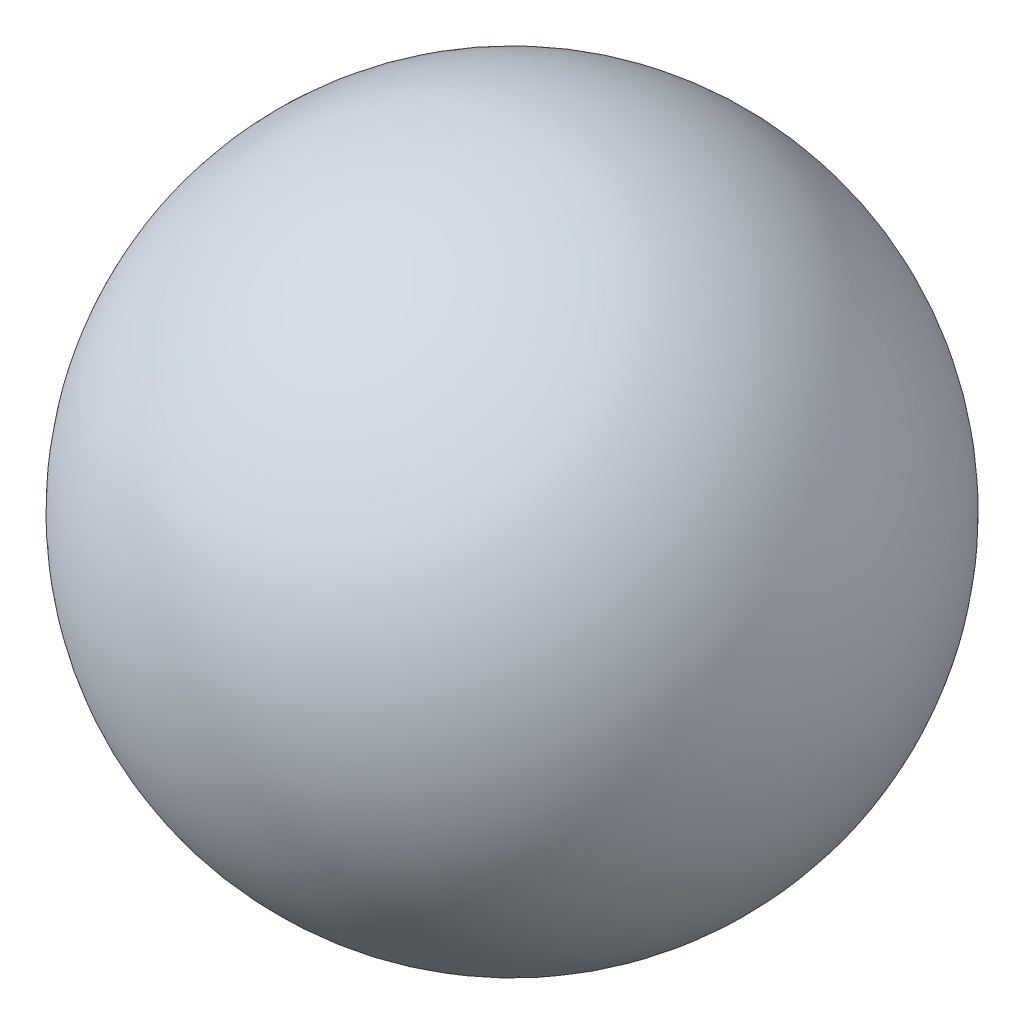
ISO-10303-21;
HEADER;
FILE_DESCRIPTION(('STEP AP214'),'2;1');
FILE_NAME('part.step','',(''),(''),'','','');
FILE_SCHEMA(('AUTOMOTIVE_DESIGN { 1 0 10303 214 1 1 1 1 }'));
ENDSEC;
DATA;
#1=APPLICATION_CONTEXT('core data for automotive mechanical design processes');
#2=APPLICATION_PROTOCOL_DEFINITION('international standard','automotive_design',2000,#1);
#3=PRODUCT_CONTEXT('',#1,'mechanical');
#4=PRODUCT('Part','Part','',(#3));
#5=PRODUCT_RELATED_PRODUCT_CATEGORY('part','',(#4));
#6=PRODUCT_DEFINITION_FORMATION('','',#4);
#7=PRODUCT_DEFINITION_CONTEXT('part definition',#1,'design');
#8=PRODUCT_DEFINITION('design','',#6,#7);
#9=PRODUCT_DEFINITION_SHAPE('','',#8);
#10=(LENGTH_UNIT() NAMED_UNIT(*) SI_UNIT(.MILLI.,.METRE.));
#11=(NAMED_UNIT(*) PLANE_ANGLE_UNIT() SI_UNIT($,.RADIAN.));
#12=(NAMED_UNIT(*) SI_UNIT($,.STERADIAN.) SOLID_ANGLE_UNIT());
#13=UNCERTAINTY_MEASURE_WITH_UNIT(LENGTH_MEASURE(1.E-05),#10,'distance_accuracy_value','');
#14=(GEOMETRIC_REPRESENTATION_CONTEXT(3) GLOBAL_UNCERTAINTY_ASSIGNED_CONTEXT((#13)) GLOBAL_UNIT_ASSIGNED_CONTEXT((#10,
#11,#12)) REPRESENTATION_CONTEXT('',''));
#15=CARTESIAN_POINT('',(0.,0.,0.));
#16=DIRECTION('',(0.,0.,1.));
#17=DIRECTION('',(1.,0.,0.));
#18=AXIS2_PLACEMENT_3D('',#15,#16,#17);
#19=CARTESIAN_POINT('',(-9.30000066,7.29999934,0.1125));
#20=DIRECTION('',(1.,0.,0.));
#21=DIRECTION('',(0.,1.,0.));
#22=AXIS2_PLACEMENT_3D('',#19,#20,#21);
#23=SPHERICAL_SURFACE('',#22,0.1125);
#24=CARTESIAN_POINT('',(-9.41250066,7.29999934,0.1125));
#25=VERTEX_POINT('',#24);
#26=VERTEX_LOOP('',#25);
#27=FACE_BOUND('',#26,.T.);
#28=CARTESIAN_POINT('',(-9.18750066,7.29999934,0.1125));
#29=VERTEX_POINT('',#28);
#30=VERTEX_LOOP('',#29);
#31=FACE_BOUND('',#30,.T.);
#32=ADVANCED_FACE('F16',(#27,#31),#23,.T.);
#33=CLOSED_SHELL('',(#32));
#34=MANIFOLD_SOLID_BREP('B1',#33);
#35=ADVANCED_BREP_SHAPE_REPRESENTATION('',(#18,#34),#14);
#36=SHAPE_DEFINITION_REPRESENTATION(#9,#35);
ENDSEC;
END-ISO-10303-21;
